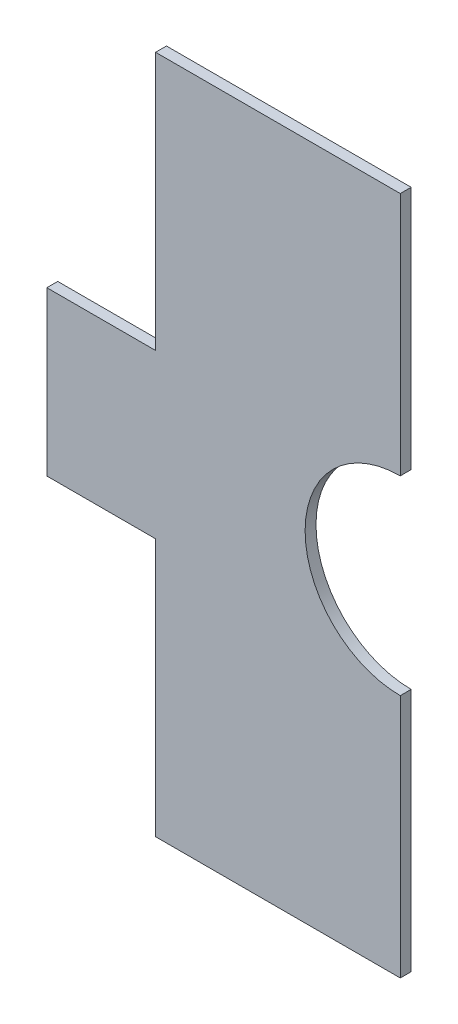
ISO-10303-21;
HEADER;
FILE_DESCRIPTION(('STEP AP214'),'2;1');
FILE_NAME('part.step','',(''),(''),'','','');
FILE_SCHEMA(('AUTOMOTIVE_DESIGN { 1 0 10303 214 1 1 1 1 }'));
ENDSEC;
DATA;
#1=APPLICATION_CONTEXT('core data for automotive mechanical design processes');
#2=APPLICATION_PROTOCOL_DEFINITION('international standard','automotive_design',2000,#1);
#3=PRODUCT_CONTEXT('',#1,'mechanical');
#4=PRODUCT('Part','Part','',(#3));
#5=PRODUCT_RELATED_PRODUCT_CATEGORY('part','',(#4));
#6=PRODUCT_DEFINITION_FORMATION('','',#4);
#7=PRODUCT_DEFINITION_CONTEXT('part definition',#1,'design');
#8=PRODUCT_DEFINITION('design','',#6,#7);
#9=PRODUCT_DEFINITION_SHAPE('','',#8);
#10=(LENGTH_UNIT() NAMED_UNIT(*) SI_UNIT(.MILLI.,.METRE.));
#11=(NAMED_UNIT(*) PLANE_ANGLE_UNIT() SI_UNIT($,.RADIAN.));
#12=(NAMED_UNIT(*) SI_UNIT($,.STERADIAN.) SOLID_ANGLE_UNIT());
#13=UNCERTAINTY_MEASURE_WITH_UNIT(LENGTH_MEASURE(1.E-05),#10,'distance_accuracy_value','');
#14=(GEOMETRIC_REPRESENTATION_CONTEXT(3) GLOBAL_UNCERTAINTY_ASSIGNED_CONTEXT((#13)) GLOBAL_UNIT_ASSIGNED_CONTEXT((#10,
#11,#12)) REPRESENTATION_CONTEXT('',''));
#15=CARTESIAN_POINT('',(0.,0.,0.));
#16=DIRECTION('',(0.,0.,1.));
#17=DIRECTION('',(1.,0.,0.));
#18=AXIS2_PLACEMENT_3D('',#15,#16,#17);
#19=CARTESIAN_POINT('',(0.55,0.3875,0.02));
#20=DIRECTION('',(1.,0.,0.));
#21=DIRECTION('',(0.,1.,0.));
#22=AXIS2_PLACEMENT_3D('',#19,#20,#21);
#23=PLANE('',#22);
#24=DIRECTION('',(0.,-1.,0.));
#25=VECTOR('',#24,1.);
#26=CARTESIAN_POINT('',(0.55,0.3875,0.));
#27=LINE('',#26,#25);
#28=CARTESIAN_POINT('',(0.55,0.625,0.));
#29=VERTEX_POINT('',#28);
#30=CARTESIAN_POINT('',(0.55,0.15,0.));
#31=VERTEX_POINT('',#30);
#32=EDGE_CURVE('E11',#29,#31,#27,.T.);
#33=ORIENTED_EDGE('',*,*,#32,.T.);
#34=DIRECTION('',(0.,0.,-1.));
#35=VECTOR('',#34,1.);
#36=CARTESIAN_POINT('',(0.55,0.15,0.02));
#37=LINE('',#36,#35);
#38=CARTESIAN_POINT('',(0.55,0.15,0.02));
#39=VERTEX_POINT('',#38);
#40=EDGE_CURVE('E42',#39,#31,#37,.T.);
#41=ORIENTED_EDGE('',*,*,#40,.F.);
#42=DIRECTION('',(0.,-1.,0.));
#43=VECTOR('',#42,1.);
#44=CARTESIAN_POINT('',(0.55,0.3875,0.02));
#45=LINE('',#44,#43);
#46=CARTESIAN_POINT('',(0.55,0.625,0.02));
#47=VERTEX_POINT('',#46);
#48=EDGE_CURVE('E124',#47,#39,#45,.T.);
#49=ORIENTED_EDGE('',*,*,#48,.F.);
#50=DIRECTION('',(0.,0.,-1.));
#51=VECTOR('',#50,1.);
#52=CARTESIAN_POINT('',(0.55,0.625,0.02));
#53=LINE('',#52,#51);
#54=EDGE_CURVE('E28',#47,#29,#53,.T.);
#55=ORIENTED_EDGE('',*,*,#54,.T.);
#56=EDGE_LOOP('',(#33,#41,#49,#55));
#57=FACE_BOUND('',#56,.T.);
#58=ADVANCED_FACE('F17',(#57),#23,.F.);
#59=CARTESIAN_POINT('',(0.45,0.15,0.02));
#60=DIRECTION('',(0.,-1.,0.));
#61=DIRECTION('',(0.,0.,-1.));
#62=AXIS2_PLACEMENT_3D('',#59,#60,#61);
#63=PLANE('',#62);
#64=DIRECTION('',(-1.,0.,0.));
#65=VECTOR('',#64,1.);
#66=CARTESIAN_POINT('',(0.45,0.15,0.));
#67=LINE('',#66,#65);
#68=CARTESIAN_POINT('',(0.35,0.15,0.));
#69=VERTEX_POINT('',#68);
#70=EDGE_CURVE('E130',#31,#69,#67,.T.);
#71=ORIENTED_EDGE('',*,*,#70,.T.);
#72=DIRECTION('',(0.,0.,-1.));
#73=VECTOR('',#72,1.);
#74=CARTESIAN_POINT('',(0.35,0.15,0.02));
#75=LINE('',#74,#73);
#76=CARTESIAN_POINT('',(0.35,0.15,0.02));
#77=VERTEX_POINT('',#76);
#78=EDGE_CURVE('E116',#77,#69,#75,.T.);
#79=ORIENTED_EDGE('',*,*,#78,.F.);
#80=DIRECTION('',(-1.,0.,0.));
#81=VECTOR('',#80,1.);
#82=CARTESIAN_POINT('',(0.45,0.15,0.02));
#83=LINE('',#82,#81);
#84=EDGE_CURVE('E201',#39,#77,#83,.T.);
#85=ORIENTED_EDGE('',*,*,#84,.F.);
#86=ORIENTED_EDGE('',*,*,#40,.T.);
#87=EDGE_LOOP('',(#71,#79,#85,#86));
#88=FACE_BOUND('',#87,.T.);
#89=ADVANCED_FACE('F298',(#88),#63,.F.);
#90=CARTESIAN_POINT('',(0.35,0.,0.02));
#91=DIRECTION('',(1.,0.,0.));
#92=DIRECTION('',(0.,1.,0.));
#93=AXIS2_PLACEMENT_3D('',#90,#91,#92);
#94=PLANE('',#93);
#95=DIRECTION('',(0.,-1.,0.));
#96=VECTOR('',#95,1.);
#97=CARTESIAN_POINT('',(0.35,0.,0.));
#98=LINE('',#97,#96);
#99=CARTESIAN_POINT('',(0.35,-0.15,0.));
#100=VERTEX_POINT('',#99);
#101=EDGE_CURVE('E164',#69,#100,#98,.T.);
#102=ORIENTED_EDGE('',*,*,#101,.T.);
#103=DIRECTION('',(0.,0.,-1.));
#104=VECTOR('',#103,1.);
#105=CARTESIAN_POINT('',(0.35,-0.15,0.02));
#106=LINE('',#105,#104);
#107=CARTESIAN_POINT('',(0.35,-0.15,0.02));
#108=VERTEX_POINT('',#107);
#109=EDGE_CURVE('E176',#108,#100,#106,.T.);
#110=ORIENTED_EDGE('',*,*,#109,.F.);
#111=DIRECTION('',(0.,-1.,0.));
#112=VECTOR('',#111,1.);
#113=CARTESIAN_POINT('',(0.35,0.,0.02));
#114=LINE('',#113,#112);
#115=EDGE_CURVE('E155',#77,#108,#114,.T.);
#116=ORIENTED_EDGE('',*,*,#115,.F.);
#117=ORIENTED_EDGE('',*,*,#78,.T.);
#118=EDGE_LOOP('',(#102,#110,#116,#117));
#119=FACE_BOUND('',#118,.T.);
#120=ADVANCED_FACE('F235',(#119),#94,.F.);
#121=CARTESIAN_POINT('',(0.45,-0.15,0.02));
#122=DIRECTION('',(0.,-1.,0.));
#123=DIRECTION('',(0.,0.,-1.));
#124=AXIS2_PLACEMENT_3D('',#121,#122,#123);
#125=PLANE('',#124);
#126=DIRECTION('',(-1.,0.,0.));
#127=VECTOR('',#126,1.);
#128=CARTESIAN_POINT('',(0.45,-0.15,0.));
#129=LINE('',#128,#127);
#130=CARTESIAN_POINT('',(0.55,-0.15,0.));
#131=VERTEX_POINT('',#130);
#132=EDGE_CURVE('E186',#131,#100,#129,.T.);
#133=ORIENTED_EDGE('',*,*,#132,.F.);
#134=DIRECTION('',(0.,0.,-1.));
#135=VECTOR('',#134,1.);
#136=CARTESIAN_POINT('',(0.55,-0.15,0.02));
#137=LINE('',#136,#135);
#138=CARTESIAN_POINT('',(0.55,-0.15,0.02));
#139=VERTEX_POINT('',#138);
#140=EDGE_CURVE('E167',#139,#131,#137,.T.);
#141=ORIENTED_EDGE('',*,*,#140,.F.);
#142=DIRECTION('',(-1.,0.,0.));
#143=VECTOR('',#142,1.);
#144=CARTESIAN_POINT('',(0.45,-0.15,0.02));
#145=LINE('',#144,#143);
#146=EDGE_CURVE('E214',#139,#108,#145,.T.);
#147=ORIENTED_EDGE('',*,*,#146,.T.);
#148=ORIENTED_EDGE('',*,*,#109,.T.);
#149=EDGE_LOOP('',(#133,#141,#147,#148));
#150=FACE_BOUND('',#149,.T.);
#151=ADVANCED_FACE('F233',(#150),#125,.T.);
#152=CARTESIAN_POINT('',(0.55,-0.38727706940591,0.02));
#153=DIRECTION('',(1.,0.,0.));
#154=DIRECTION('',(0.,1.,0.));
#155=AXIS2_PLACEMENT_3D('',#152,#153,#154);
#156=PLANE('',#155);
#157=DIRECTION('',(0.,-1.,0.));
#158=VECTOR('',#157,1.);
#159=CARTESIAN_POINT('',(0.55,-0.38727706940591,0.));
#160=LINE('',#159,#158);
#161=CARTESIAN_POINT('',(0.55,-0.62455413881182,0.));
#162=VERTEX_POINT('',#161);
#163=EDGE_CURVE('E171',#131,#162,#160,.T.);
#164=ORIENTED_EDGE('',*,*,#163,.T.);
#165=DIRECTION('',(0.,0.,-1.));
#166=VECTOR('',#165,1.);
#167=CARTESIAN_POINT('',(0.55,-0.62455413881182,0.02));
#168=LINE('',#167,#166);
#169=CARTESIAN_POINT('',(0.55,-0.62455413881182,0.02));
#170=VERTEX_POINT('',#169);
#171=EDGE_CURVE('E177',#170,#162,#168,.T.);
#172=ORIENTED_EDGE('',*,*,#171,.F.);
#173=DIRECTION('',(0.,-1.,0.));
#174=VECTOR('',#173,1.);
#175=CARTESIAN_POINT('',(0.55,-0.38727706940591,0.02));
#176=LINE('',#175,#174);
#177=EDGE_CURVE('E187',#139,#170,#176,.T.);
#178=ORIENTED_EDGE('',*,*,#177,.F.);
#179=ORIENTED_EDGE('',*,*,#140,.T.);
#180=EDGE_LOOP('',(#164,#172,#178,#179));
#181=FACE_BOUND('',#180,.T.);
#182=ADVANCED_FACE('F241',(#181),#156,.F.);
#183=CARTESIAN_POINT('',(0.775,-0.62455413881182,0.02));
#184=DIRECTION('',(0.,1.,0.));
#185=DIRECTION('',(1.,0.,0.));
#186=AXIS2_PLACEMENT_3D('',#183,#184,#185);
#187=PLANE('',#186);
#188=DIRECTION('',(1.,0.,0.));
#189=VECTOR('',#188,1.);
#190=CARTESIAN_POINT('',(0.775,-0.62455413881182,0.));
#191=LINE('',#190,#189);
#192=CARTESIAN_POINT('',(1.,-0.62455413881182,0.));
#193=VERTEX_POINT('',#192);
#194=EDGE_CURVE('E172',#162,#193,#191,.T.);
#195=ORIENTED_EDGE('',*,*,#194,.T.);
#196=DIRECTION('',(0.,0.,-1.));
#197=VECTOR('',#196,1.);
#198=CARTESIAN_POINT('',(1.,-0.62455413881182,0.02));
#199=LINE('',#198,#197);
#200=CARTESIAN_POINT('',(1.,-0.62455413881182,0.02));
#201=VERTEX_POINT('',#200);
#202=EDGE_CURVE('E157',#201,#193,#199,.T.);
#203=ORIENTED_EDGE('',*,*,#202,.F.);
#204=DIRECTION('',(1.,0.,0.));
#205=VECTOR('',#204,1.);
#206=CARTESIAN_POINT('',(0.775,-0.62455413881182,0.02));
#207=LINE('',#206,#205);
#208=EDGE_CURVE('E149',#170,#201,#207,.T.);
#209=ORIENTED_EDGE('',*,*,#208,.F.);
#210=ORIENTED_EDGE('',*,*,#171,.T.);
#211=EDGE_LOOP('',(#195,#203,#209,#210));
#212=FACE_BOUND('',#211,.T.);
#213=ADVANCED_FACE('F310',(#212),#187,.F.);
#214=CARTESIAN_POINT('',(1.,-0.399665604108865,0.02));
#215=DIRECTION('',(-1.,0.,0.));
#216=DIRECTION('',(0.,0.,1.));
#217=AXIS2_PLACEMENT_3D('',#214,#215,#216);
#218=PLANE('',#217);
#219=DIRECTION('',(0.,1.,0.));
#220=VECTOR('',#219,1.);
#221=CARTESIAN_POINT('',(1.,-0.399665604108865,0.));
#222=LINE('',#221,#220);
#223=CARTESIAN_POINT('',(1.,-0.17477706940591,0.));
#224=VERTEX_POINT('',#223);
#225=EDGE_CURVE('E160',#193,#224,#222,.T.);
#226=ORIENTED_EDGE('',*,*,#225,.T.);
#227=DIRECTION('',(0.,0.,-1.));
#228=VECTOR('',#227,1.);
#229=CARTESIAN_POINT('',(1.,-0.17477706940591,0.02));
#230=LINE('',#229,#228);
#231=CARTESIAN_POINT('',(1.,-0.17477706940591,0.02));
#232=VERTEX_POINT('',#231);
#233=EDGE_CURVE('E209',#232,#224,#230,.T.);
#234=ORIENTED_EDGE('',*,*,#233,.F.);
#235=DIRECTION('',(0.,1.,0.));
#236=VECTOR('',#235,1.);
#237=CARTESIAN_POINT('',(1.,-0.399665604108865,0.02));
#238=LINE('',#237,#236);
#239=EDGE_CURVE('E141',#201,#232,#238,.T.);
#240=ORIENTED_EDGE('',*,*,#239,.F.);
#241=ORIENTED_EDGE('',*,*,#202,.T.);
#242=EDGE_LOOP('',(#226,#234,#240,#241));
#243=FACE_BOUND('',#242,.T.);
#244=ADVANCED_FACE('F304',(#243),#218,.F.);
#245=CARTESIAN_POINT('',(1.,0.000222930594089878,0.02));
#246=DIRECTION('',(0.,0.,-1.));
#247=DIRECTION('',(-1.,0.,0.));
#248=AXIS2_PLACEMENT_3D('',#245,#246,#247);
#249=CYLINDRICAL_SURFACE('',#248,0.175);
#250=CARTESIAN_POINT('',(1.,0.000222930594089878,0.));
#251=DIRECTION('',(0.,0.,1.));
#252=DIRECTION('',(1.,0.,0.));
#253=AXIS2_PLACEMENT_3D('',#250,#251,#252);
#254=CIRCLE('',#253,0.175);
#255=CARTESIAN_POINT('',(1.,0.17522293059409,0.));
#256=VERTEX_POINT('',#255);
#257=EDGE_CURVE('E151',#256,#224,#254,.T.);
#258=ORIENTED_EDGE('',*,*,#257,.F.);
#259=DIRECTION('',(0.,0.,-1.));
#260=VECTOR('',#259,1.);
#261=CARTESIAN_POINT('',(1.,0.17522293059409,0.02));
#262=LINE('',#261,#260);
#263=CARTESIAN_POINT('',(1.,0.17522293059409,0.02));
#264=VERTEX_POINT('',#263);
#265=EDGE_CURVE('E21',#264,#256,#262,.T.);
#266=ORIENTED_EDGE('',*,*,#265,.F.);
#267=CARTESIAN_POINT('',(1.,0.000222930594089878,0.02));
#268=DIRECTION('',(0.,0.,1.));
#269=DIRECTION('',(1.,0.,0.));
#270=AXIS2_PLACEMENT_3D('',#267,#268,#269);
#271=CIRCLE('',#270,0.175);
#272=EDGE_CURVE('E161',#264,#232,#271,.T.);
#273=ORIENTED_EDGE('',*,*,#272,.T.);
#274=ORIENTED_EDGE('',*,*,#233,.T.);
#275=EDGE_LOOP('',(#258,#266,#273,#274));
#276=FACE_BOUND('',#275,.T.);
#277=ADVANCED_FACE('F309',(#276),#249,.F.);
#278=CARTESIAN_POINT('',(1.,0.400111465297045,0.02));
#279=DIRECTION('',(1.,0.,0.));
#280=DIRECTION('',(0.,1.,0.));
#281=AXIS2_PLACEMENT_3D('',#278,#279,#280);
#282=PLANE('',#281);
#283=DIRECTION('',(0.,-1.,0.));
#284=VECTOR('',#283,1.);
#285=CARTESIAN_POINT('',(1.,0.400111465297045,0.));
#286=LINE('',#285,#284);
#287=CARTESIAN_POINT('',(1.,0.625,0.));
#288=VERTEX_POINT('',#287);
#289=EDGE_CURVE('E142',#288,#256,#286,.T.);
#290=ORIENTED_EDGE('',*,*,#289,.F.);
#291=DIRECTION('',(0.,0.,-1.));
#292=VECTOR('',#291,1.);
#293=CARTESIAN_POINT('',(1.,0.625,0.02));
#294=LINE('',#293,#292);
#295=CARTESIAN_POINT('',(1.,0.625,0.02));
#296=VERTEX_POINT('',#295);
#297=EDGE_CURVE('E139',#296,#288,#294,.T.);
#298=ORIENTED_EDGE('',*,*,#297,.F.);
#299=DIRECTION('',(0.,-1.,0.));
#300=VECTOR('',#299,1.);
#301=CARTESIAN_POINT('',(1.,0.400111465297045,0.02));
#302=LINE('',#301,#300);
#303=EDGE_CURVE('E196',#296,#264,#302,.T.);
#304=ORIENTED_EDGE('',*,*,#303,.T.);
#305=ORIENTED_EDGE('',*,*,#265,.T.);
#306=EDGE_LOOP('',(#290,#298,#304,#305));
#307=FACE_BOUND('',#306,.T.);
#308=ADVANCED_FACE('F317',(#307),#282,.T.);
#309=CARTESIAN_POINT('',(0.775,0.625,0.02));
#310=DIRECTION('',(0.,1.,0.));
#311=DIRECTION('',(1.,0.,0.));
#312=AXIS2_PLACEMENT_3D('',#309,#310,#311);
#313=PLANE('',#312);
#314=DIRECTION('',(1.,0.,0.));
#315=VECTOR('',#314,1.);
#316=CARTESIAN_POINT('',(0.775,0.625,0.));
#317=LINE('',#316,#315);
#318=EDGE_CURVE('E135',#29,#288,#317,.T.);
#319=ORIENTED_EDGE('',*,*,#318,.F.);
#320=ORIENTED_EDGE('',*,*,#54,.F.);
#321=DIRECTION('',(1.,0.,0.));
#322=VECTOR('',#321,1.);
#323=CARTESIAN_POINT('',(0.775,0.625,0.02));
#324=LINE('',#323,#322);
#325=EDGE_CURVE('E189',#47,#296,#324,.T.);
#326=ORIENTED_EDGE('',*,*,#325,.T.);
#327=ORIENTED_EDGE('',*,*,#297,.T.);
#328=EDGE_LOOP('',(#319,#320,#326,#327));
#329=FACE_BOUND('',#328,.T.);
#330=ADVANCED_FACE('F138',(#329),#313,.T.);
#331=CARTESIAN_POINT('',(0.,0.000222930594089878,0.02));
#332=DIRECTION('',(0.,0.,1.));
#333=DIRECTION('',(1.,0.,0.));
#334=AXIS2_PLACEMENT_3D('',#331,#332,#333);
#335=PLANE('',#334);
#336=ORIENTED_EDGE('',*,*,#48,.T.);
#337=ORIENTED_EDGE('',*,*,#84,.T.);
#338=ORIENTED_EDGE('',*,*,#115,.T.);
#339=ORIENTED_EDGE('',*,*,#146,.F.);
#340=ORIENTED_EDGE('',*,*,#177,.T.);
#341=ORIENTED_EDGE('',*,*,#208,.T.);
#342=ORIENTED_EDGE('',*,*,#239,.T.);
#343=ORIENTED_EDGE('',*,*,#272,.F.);
#344=ORIENTED_EDGE('',*,*,#303,.F.);
#345=ORIENTED_EDGE('',*,*,#325,.F.);
#346=EDGE_LOOP('',(#336,#337,#338,#339,#340,#341,#342,#343,#344,#345));
#347=FACE_BOUND('',#346,.T.);
#348=ADVANCED_FACE('F245',(#347),#335,.T.);
#349=CARTESIAN_POINT('',(0.,0.000222930594089878,0.));
#350=DIRECTION('',(0.,0.,1.));
#351=DIRECTION('',(1.,0.,0.));
#352=AXIS2_PLACEMENT_3D('',#349,#350,#351);
#353=PLANE('',#352);
#354=ORIENTED_EDGE('',*,*,#32,.F.);
#355=ORIENTED_EDGE('',*,*,#318,.T.);
#356=ORIENTED_EDGE('',*,*,#289,.T.);
#357=ORIENTED_EDGE('',*,*,#257,.T.);
#358=ORIENTED_EDGE('',*,*,#225,.F.);
#359=ORIENTED_EDGE('',*,*,#194,.F.);
#360=ORIENTED_EDGE('',*,*,#163,.F.);
#361=ORIENTED_EDGE('',*,*,#132,.T.);
#362=ORIENTED_EDGE('',*,*,#101,.F.);
#363=ORIENTED_EDGE('',*,*,#70,.F.);
#364=EDGE_LOOP('',(#354,#355,#356,#357,#358,#359,#360,#361,#362,#363));
#365=FACE_BOUND('',#364,.T.);
#366=ADVANCED_FACE('F19',(#365),#353,.F.);
#367=CLOSED_SHELL('',(#58,#89,#120,#151,#182,#213,#244,#277,#308,#330,#348,#366));
#368=MANIFOLD_SOLID_BREP('B1',#367);
#369=ADVANCED_BREP_SHAPE_REPRESENTATION('',(#18,#368),#14);
#370=SHAPE_DEFINITION_REPRESENTATION(#9,#369);
ENDSEC;
END-ISO-10303-21;
